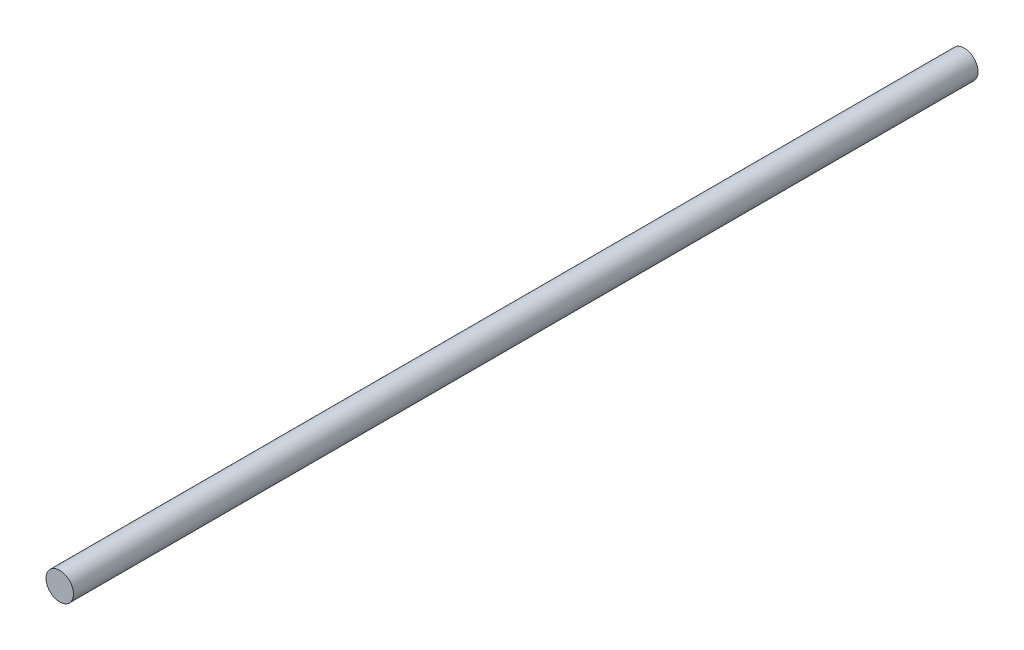
ISO-10303-21;
HEADER;
FILE_DESCRIPTION(('STEP AP214'),'2;1');
FILE_NAME('part.step','',(''),(''),'','','');
FILE_SCHEMA(('AUTOMOTIVE_DESIGN { 1 0 10303 214 1 1 1 1 }'));
ENDSEC;
DATA;
#1=APPLICATION_CONTEXT('core data for automotive mechanical design processes');
#2=APPLICATION_PROTOCOL_DEFINITION('international standard','automotive_design',2000,#1);
#3=PRODUCT_CONTEXT('',#1,'mechanical');
#4=PRODUCT('Part','Part','',(#3));
#5=PRODUCT_RELATED_PRODUCT_CATEGORY('part','',(#4));
#6=PRODUCT_DEFINITION_FORMATION('','',#4);
#7=PRODUCT_DEFINITION_CONTEXT('part definition',#1,'design');
#8=PRODUCT_DEFINITION('design','',#6,#7);
#9=PRODUCT_DEFINITION_SHAPE('','',#8);
#10=(LENGTH_UNIT() NAMED_UNIT(*) SI_UNIT(.MILLI.,.METRE.));
#11=(NAMED_UNIT(*) PLANE_ANGLE_UNIT() SI_UNIT($,.RADIAN.));
#12=(NAMED_UNIT(*) SI_UNIT($,.STERADIAN.) SOLID_ANGLE_UNIT());
#13=UNCERTAINTY_MEASURE_WITH_UNIT(LENGTH_MEASURE(1.E-05),#10,'distance_accuracy_value','');
#14=(GEOMETRIC_REPRESENTATION_CONTEXT(3) GLOBAL_UNCERTAINTY_ASSIGNED_CONTEXT((#13)) GLOBAL_UNIT_ASSIGNED_CONTEXT((#10,
#11,#12)) REPRESENTATION_CONTEXT('',''));
#15=CARTESIAN_POINT('',(0.,0.,0.));
#16=DIRECTION('',(0.,0.,1.));
#17=DIRECTION('',(1.,0.,0.));
#18=AXIS2_PLACEMENT_3D('',#15,#16,#17);
#19=CARTESIAN_POINT('',(0.,0.,164.7));
#20=DIRECTION('',(0.,0.,-1.));
#21=DIRECTION('',(-1.,0.,0.));
#22=AXIS2_PLACEMENT_3D('',#19,#20,#21);
#23=CYLINDRICAL_SURFACE('',#22,2.5);
#24=CARTESIAN_POINT('',(0.,0.,164.7));
#25=DIRECTION('',(0.,0.,1.));
#26=DIRECTION('',(1.,0.,0.));
#27=AXIS2_PLACEMENT_3D('',#24,#25,#26);
#28=CIRCLE('',#27,2.5);
#29=CARTESIAN_POINT('',(-2.5,0.,164.7));
#30=VERTEX_POINT('',#29);
#31=EDGE_CURVE('E10',#30,#30,#28,.T.);
#32=CARTESIAN_POINT('',(0.,0.,0.));
#33=DIRECTION('',(0.,0.,1.));
#34=DIRECTION('',(1.,0.,0.));
#35=AXIS2_PLACEMENT_3D('',#32,#33,#34);
#36=CIRCLE('',#35,2.5);
#37=CARTESIAN_POINT('',(-2.5,0.,0.));
#38=VERTEX_POINT('',#37);
#39=EDGE_CURVE('E34',#38,#38,#36,.T.);
#40=CARTESIAN_POINT('',(-2.5,0.,164.7));
#41=CARTESIAN_POINT('',(-2.5,0.,162.984375));
#42=CARTESIAN_POINT('',(-2.5,0.,161.26875));
#43=CARTESIAN_POINT('',(-2.5,0.,157.8375));
#44=CARTESIAN_POINT('',(-2.5,0.,156.121875));
#45=CARTESIAN_POINT('',(-2.5,0.,152.690625));
#46=CARTESIAN_POINT('',(-2.5,0.,150.975));
#47=CARTESIAN_POINT('',(-2.5,0.,147.54375));
#48=CARTESIAN_POINT('',(-2.5,0.,145.828125));
#49=CARTESIAN_POINT('',(-2.5,0.,142.396875));
#50=CARTESIAN_POINT('',(-2.5,0.,140.68125));
#51=CARTESIAN_POINT('',(-2.5,0.,137.25));
#52=CARTESIAN_POINT('',(-2.5,0.,135.534375));
#53=CARTESIAN_POINT('',(-2.5,0.,132.103125));
#54=CARTESIAN_POINT('',(-2.5,0.,130.3875));
#55=CARTESIAN_POINT('',(-2.5,0.,126.95625));
#56=CARTESIAN_POINT('',(-2.5,0.,125.240625));
#57=CARTESIAN_POINT('',(-2.5,0.,121.809375));
#58=CARTESIAN_POINT('',(-2.5,0.,120.09375));
#59=CARTESIAN_POINT('',(-2.5,0.,116.6625));
#60=CARTESIAN_POINT('',(-2.5,0.,114.946875));
#61=CARTESIAN_POINT('',(-2.5,0.,111.515625));
#62=CARTESIAN_POINT('',(-2.5,0.,109.8));
#63=CARTESIAN_POINT('',(-2.5,0.,106.36875));
#64=CARTESIAN_POINT('',(-2.5,0.,104.653125));
#65=CARTESIAN_POINT('',(-2.5,0.,101.221875));
#66=CARTESIAN_POINT('',(-2.5,0.,99.50625));
#67=CARTESIAN_POINT('',(-2.5,0.,96.075));
#68=CARTESIAN_POINT('',(-2.5,0.,94.359375));
#69=CARTESIAN_POINT('',(-2.5,0.,90.928125));
#70=CARTESIAN_POINT('',(-2.5,0.,89.2125));
#71=CARTESIAN_POINT('',(-2.5,0.,85.78125));
#72=CARTESIAN_POINT('',(-2.5,0.,84.065625));
#73=CARTESIAN_POINT('',(-2.5,0.,80.634375));
#74=CARTESIAN_POINT('',(-2.5,0.,78.91875));
#75=CARTESIAN_POINT('',(-2.5,0.,75.4875));
#76=CARTESIAN_POINT('',(-2.5,0.,73.771875));
#77=CARTESIAN_POINT('',(-2.5,0.,70.340625));
#78=CARTESIAN_POINT('',(-2.5,0.,68.625));
#79=CARTESIAN_POINT('',(-2.5,0.,65.19375));
#80=CARTESIAN_POINT('',(-2.5,0.,63.478125));
#81=CARTESIAN_POINT('',(-2.5,0.,60.046875));
#82=CARTESIAN_POINT('',(-2.5,0.,58.33125));
#83=CARTESIAN_POINT('',(-2.5,0.,54.9));
#84=CARTESIAN_POINT('',(-2.5,0.,53.184375));
#85=CARTESIAN_POINT('',(-2.5,0.,49.753125));
#86=CARTESIAN_POINT('',(-2.5,0.,48.0375));
#87=CARTESIAN_POINT('',(-2.5,0.,44.60625));
#88=CARTESIAN_POINT('',(-2.5,0.,42.890625));
#89=CARTESIAN_POINT('',(-2.5,0.,39.459375));
#90=CARTESIAN_POINT('',(-2.5,0.,37.74375));
#91=CARTESIAN_POINT('',(-2.5,0.,34.3125));
#92=CARTESIAN_POINT('',(-2.5,0.,32.596875));
#93=CARTESIAN_POINT('',(-2.5,0.,29.165625));
#94=CARTESIAN_POINT('',(-2.5,0.,27.45));
#95=CARTESIAN_POINT('',(-2.5,0.,24.01875));
#96=CARTESIAN_POINT('',(-2.5,0.,22.303125));
#97=CARTESIAN_POINT('',(-2.5,0.,18.871875));
#98=CARTESIAN_POINT('',(-2.5,0.,17.15625));
#99=CARTESIAN_POINT('',(-2.5,0.,13.725));
#100=CARTESIAN_POINT('',(-2.5,0.,12.009375));
#101=CARTESIAN_POINT('',(-2.5,0.,8.57812499999999));
#102=CARTESIAN_POINT('',(-2.5,0.,6.86249999999999));
#103=CARTESIAN_POINT('',(-2.5,0.,3.43125));
#104=CARTESIAN_POINT('',(-2.5,0.,1.715625));
#105=CARTESIAN_POINT('',(-2.5,0.,0.));
#106=B_SPLINE_CURVE_WITH_KNOTS('',3,(#40,#41,#42,#43,#44,#45,#46,#47,#48,#49,#50,#51,#52,#53,
#54,#55,#56,#57,#58,#59,#60,#61,#62,#63,#64,#65,#66,#67,#68,#69,#70,#71,#72,#73,#74,#75,#76,#77,
#78,#79,#80,#81,#82,#83,#84,#85,#86,#87,#88,#89,#90,#91,#92,#93,#94,#95,#96,#97,#98,#99,#100,
#101,#102,#103,#104,#105),.UNSPECIFIED.,.F.,.F.,(4,2,2,2,2,2,2,2,2,2,2,2,2,2,2,2,2,2,2,2,2,2,2,
2,2,2,2,2,2,2,2,2,4),(0.,5.14687500000002,10.29375,15.440625,20.5875,25.734375,30.88125,
36.028125,41.175,46.321875,51.46875,56.615625,61.7625,66.909375,72.05625,77.203125,82.35,
87.496875,92.64375,97.790625,102.9375,108.084375,113.23125,118.378125,123.525,128.671875,
133.81875,138.965625,144.1125,149.259375,154.40625,159.553125,164.7),.UNSPECIFIED.);
#107=EDGE_CURVE('BSEAM31',#30,#38,#106,.T.);
#108=ORIENTED_EDGE('',*,*,#31,.F.);
#109=ORIENTED_EDGE('',*,*,#39,.T.);
#110=ORIENTED_EDGE('',*,*,#107,.T.);
#111=ORIENTED_EDGE('',*,*,#107,.F.);
#112=EDGE_LOOP('',(#108,#110,#109,#111));
#113=FACE_BOUND('',#112,.T.);
#114=ADVANCED_FACE('F31',(#113),#23,.T.);
#115=CARTESIAN_POINT('',(0.,0.,164.7));
#116=DIRECTION('',(0.,0.,1.));
#117=DIRECTION('',(1.,0.,0.));
#118=AXIS2_PLACEMENT_3D('',#115,#116,#117);
#119=PLANE('',#118);
#120=ORIENTED_EDGE('',*,*,#31,.T.);
#121=EDGE_LOOP('',(#120));
#122=FACE_BOUND('',#121,.T.);
#123=ADVANCED_FACE('F46',(#122),#119,.T.);
#124=CARTESIAN_POINT('',(0.,0.,0.));
#125=DIRECTION('',(0.,0.,1.));
#126=DIRECTION('',(1.,0.,0.));
#127=AXIS2_PLACEMENT_3D('',#124,#125,#126);
#128=PLANE('',#127);
#129=ORIENTED_EDGE('',*,*,#39,.F.);
#130=EDGE_LOOP('',(#129));
#131=FACE_BOUND('',#130,.T.);
#132=ADVANCED_FACE('F44',(#131),#128,.F.);
#133=CLOSED_SHELL('',(#114,#123,#132));
#134=MANIFOLD_SOLID_BREP('B2',#133);
#135=ADVANCED_BREP_SHAPE_REPRESENTATION('',(#18,#134),#14);
#136=SHAPE_DEFINITION_REPRESENTATION(#9,#135);
ENDSEC;
END-ISO-10303-21;
